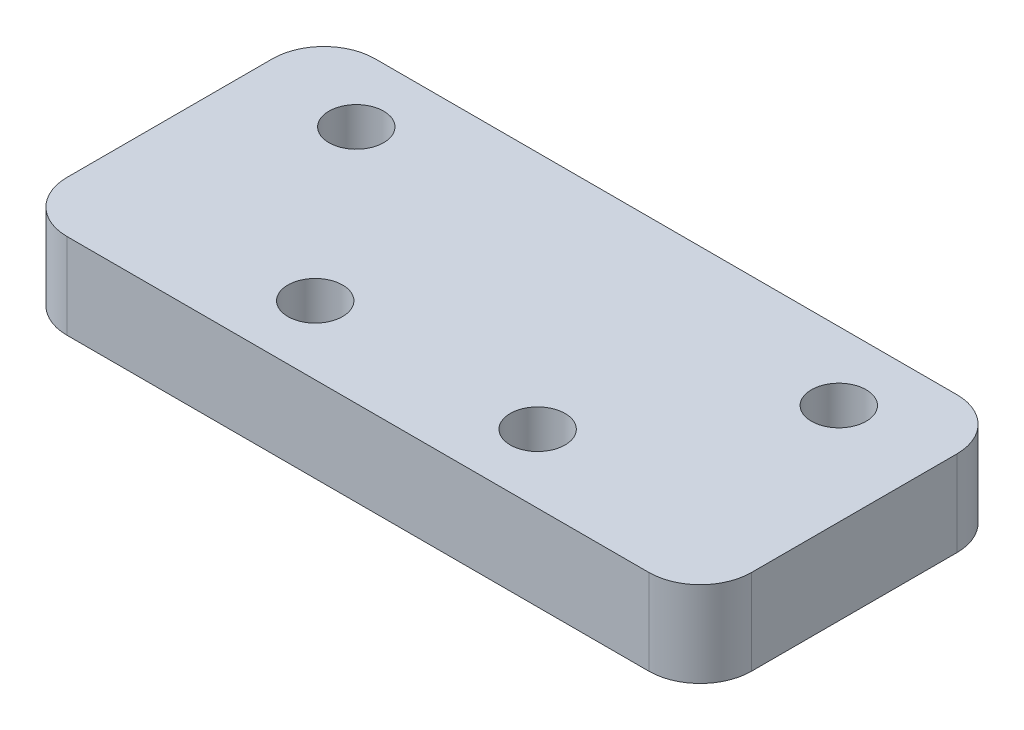
ISO-10303-21;
HEADER;
FILE_DESCRIPTION(('STEP AP214'),'2;1');
FILE_NAME('part.step','',(''),(''),'','','');
FILE_SCHEMA(('AUTOMOTIVE_DESIGN { 1 0 10303 214 1 1 1 1 }'));
ENDSEC;
DATA;
#1=APPLICATION_CONTEXT('core data for automotive mechanical design processes');
#2=APPLICATION_PROTOCOL_DEFINITION('international standard','automotive_design',2000,#1);
#3=PRODUCT_CONTEXT('',#1,'mechanical');
#4=PRODUCT('Part','Part','',(#3));
#5=PRODUCT_RELATED_PRODUCT_CATEGORY('part','',(#4));
#6=PRODUCT_DEFINITION_FORMATION('','',#4);
#7=PRODUCT_DEFINITION_CONTEXT('part definition',#1,'design');
#8=PRODUCT_DEFINITION('design','',#6,#7);
#9=PRODUCT_DEFINITION_SHAPE('','',#8);
#10=(LENGTH_UNIT() NAMED_UNIT(*) SI_UNIT(.MILLI.,.METRE.));
#11=(NAMED_UNIT(*) PLANE_ANGLE_UNIT() SI_UNIT($,.RADIAN.));
#12=(NAMED_UNIT(*) SI_UNIT($,.STERADIAN.) SOLID_ANGLE_UNIT());
#13=UNCERTAINTY_MEASURE_WITH_UNIT(LENGTH_MEASURE(1.E-05),#10,'distance_accuracy_value','');
#14=(GEOMETRIC_REPRESENTATION_CONTEXT(3) GLOBAL_UNCERTAINTY_ASSIGNED_CONTEXT((#13)) GLOBAL_UNIT_ASSIGNED_CONTEXT((#10,
#11,#12)) REPRESENTATION_CONTEXT('',''));
#15=CARTESIAN_POINT('',(0.,0.,0.));
#16=DIRECTION('',(0.,0.,1.));
#17=DIRECTION('',(1.,0.,0.));
#18=AXIS2_PLACEMENT_3D('',#15,#16,#17);
#19=CARTESIAN_POINT('',(0.,5.,0.));
#20=DIRECTION('',(0.,-1.,0.));
#21=DIRECTION('',(0.,0.,-1.));
#22=AXIS2_PLACEMENT_3D('',#19,#20,#21);
#23=PLANE('',#22);
#24=DIRECTION('',(0.,0.,-1.));
#25=VECTOR('',#24,1.);
#26=CARTESIAN_POINT('',(40.,5.,0.));
#27=LINE('',#26,#25);
#28=CARTESIAN_POINT('',(40.,5.,-3.));
#29=VERTEX_POINT('',#28);
#30=CARTESIAN_POINT('',(40.,5.,-15.));
#31=VERTEX_POINT('',#30);
#32=EDGE_CURVE('E217',#29,#31,#27,.T.);
#33=ORIENTED_EDGE('',*,*,#32,.T.);
#34=CARTESIAN_POINT('',(37.,5.,-15.));
#35=DIRECTION('',(0.,-1.,0.));
#36=DIRECTION('',(0.,0.,-1.));
#37=AXIS2_PLACEMENT_3D('',#34,#35,#36);
#38=CIRCLE('',#37,3.);
#39=CARTESIAN_POINT('',(37.,5.,-18.));
#40=VERTEX_POINT('',#39);
#41=EDGE_CURVE('E184',#31,#40,#38,.F.);
#42=ORIENTED_EDGE('',*,*,#41,.T.);
#43=DIRECTION('',(-1.,0.,0.));
#44=VECTOR('',#43,1.);
#45=CARTESIAN_POINT('',(0.,5.,-18.));
#46=LINE('',#45,#44);
#47=CARTESIAN_POINT('',(3.,5.,-18.));
#48=VERTEX_POINT('',#47);
#49=EDGE_CURVE('E141',#40,#48,#46,.T.);
#50=ORIENTED_EDGE('',*,*,#49,.T.);
#51=CARTESIAN_POINT('',(3.,5.,-15.));
#52=DIRECTION('',(0.,-1.,0.));
#53=DIRECTION('',(0.,0.,-1.));
#54=AXIS2_PLACEMENT_3D('',#51,#52,#53);
#55=CIRCLE('',#54,3.);
#56=CARTESIAN_POINT('',(0.,5.,-15.));
#57=VERTEX_POINT('',#56);
#58=EDGE_CURVE('E176',#48,#57,#55,.F.);
#59=ORIENTED_EDGE('',*,*,#58,.T.);
#60=DIRECTION('',(0.,0.,1.));
#61=VECTOR('',#60,1.);
#62=CARTESIAN_POINT('',(0.,5.,0.));
#63=LINE('',#62,#61);
#64=CARTESIAN_POINT('',(0.,5.,-3.));
#65=VERTEX_POINT('',#64);
#66=EDGE_CURVE('E150',#57,#65,#63,.T.);
#67=ORIENTED_EDGE('',*,*,#66,.T.);
#68=CARTESIAN_POINT('',(3.,5.,-3.));
#69=DIRECTION('',(0.,-1.,0.));
#70=DIRECTION('',(0.,0.,-1.));
#71=AXIS2_PLACEMENT_3D('',#68,#69,#70);
#72=CIRCLE('',#71,3.);
#73=CARTESIAN_POINT('',(3.,5.,0.));
#74=VERTEX_POINT('',#73);
#75=EDGE_CURVE('E76',#65,#74,#72,.F.);
#76=ORIENTED_EDGE('',*,*,#75,.T.);
#77=DIRECTION('',(1.,0.,0.));
#78=VECTOR('',#77,1.);
#79=CARTESIAN_POINT('',(0.,5.,0.));
#80=LINE('',#79,#78);
#81=CARTESIAN_POINT('',(37.,5.,0.));
#82=VERTEX_POINT('',#81);
#83=EDGE_CURVE('E156',#74,#82,#80,.T.);
#84=ORIENTED_EDGE('',*,*,#83,.T.);
#85=CARTESIAN_POINT('',(37.,5.,-3.));
#86=DIRECTION('',(0.,-1.,0.));
#87=DIRECTION('',(0.,0.,-1.));
#88=AXIS2_PLACEMENT_3D('',#85,#86,#87);
#89=CIRCLE('',#88,3.);
#90=EDGE_CURVE('E181',#82,#29,#89,.F.);
#91=ORIENTED_EDGE('',*,*,#90,.T.);
#92=EDGE_LOOP('',(#33,#42,#50,#59,#67,#76,#84,#91));
#93=FACE_BOUND('',#92,.T.);
#94=CARTESIAN_POINT('',(5.9,5.,-14.));
#95=DIRECTION('',(0.,1.,0.));
#96=DIRECTION('',(0.,0.,1.));
#97=AXIS2_PLACEMENT_3D('',#94,#95,#96);
#98=CIRCLE('',#97,1.6);
#99=CARTESIAN_POINT('',(5.9,5.,-12.4));
#100=VERTEX_POINT('',#99);
#101=EDGE_CURVE('E206',#100,#100,#98,.T.);
#102=ORIENTED_EDGE('',*,*,#101,.F.);
#103=EDGE_LOOP('',(#102));
#104=FACE_BOUND('',#103,.T.);
#105=CARTESIAN_POINT('',(34.1,5.,-14.));
#106=DIRECTION('',(0.,1.,0.));
#107=DIRECTION('',(0.,0.,1.));
#108=AXIS2_PLACEMENT_3D('',#105,#106,#107);
#109=CIRCLE('',#108,1.6);
#110=CARTESIAN_POINT('',(34.1,5.,-12.4));
#111=VERTEX_POINT('',#110);
#112=EDGE_CURVE('E225',#111,#111,#109,.T.);
#113=ORIENTED_EDGE('',*,*,#112,.F.);
#114=EDGE_LOOP('',(#113));
#115=FACE_BOUND('',#114,.T.);
#116=CARTESIAN_POINT('',(13.5,5.,-4.));
#117=DIRECTION('',(0.,1.,0.));
#118=DIRECTION('',(0.,0.,1.));
#119=AXIS2_PLACEMENT_3D('',#116,#117,#118);
#120=CIRCLE('',#119,1.6);
#121=CARTESIAN_POINT('',(13.5,5.,-2.4));
#122=VERTEX_POINT('',#121);
#123=EDGE_CURVE('E231',#122,#122,#120,.T.);
#124=ORIENTED_EDGE('',*,*,#123,.F.);
#125=EDGE_LOOP('',(#124));
#126=FACE_BOUND('',#125,.T.);
#127=CARTESIAN_POINT('',(26.5,5.,-4.));
#128=DIRECTION('',(0.,1.,0.));
#129=DIRECTION('',(0.,0.,1.));
#130=AXIS2_PLACEMENT_3D('',#127,#128,#129);
#131=CIRCLE('',#130,1.6);
#132=CARTESIAN_POINT('',(26.5,5.,-2.4));
#133=VERTEX_POINT('',#132);
#134=EDGE_CURVE('E239',#133,#133,#131,.T.);
#135=ORIENTED_EDGE('',*,*,#134,.F.);
#136=EDGE_LOOP('',(#135));
#137=FACE_BOUND('',#136,.T.);
#138=ADVANCED_FACE('F53',(#93,#104,#115,#126,#137),#23,.F.);
#139=CARTESIAN_POINT('',(0.,0.,0.));
#140=DIRECTION('',(0.,-1.,0.));
#141=DIRECTION('',(0.,0.,-1.));
#142=AXIS2_PLACEMENT_3D('',#139,#140,#141);
#143=PLANE('',#142);
#144=CARTESIAN_POINT('',(13.5,0.,-4.));
#145=DIRECTION('',(0.,1.,0.));
#146=DIRECTION('',(0.,0.,1.));
#147=AXIS2_PLACEMENT_3D('',#144,#145,#146);
#148=CIRCLE('',#147,1.6);
#149=CARTESIAN_POINT('',(13.5,0.,-2.4));
#150=VERTEX_POINT('',#149);
#151=EDGE_CURVE('E235',#150,#150,#148,.T.);
#152=ORIENTED_EDGE('',*,*,#151,.T.);
#153=EDGE_LOOP('',(#152));
#154=FACE_BOUND('',#153,.T.);
#155=CARTESIAN_POINT('',(5.9,0.,-14.));
#156=DIRECTION('',(0.,1.,0.));
#157=DIRECTION('',(0.,0.,1.));
#158=AXIS2_PLACEMENT_3D('',#155,#156,#157);
#159=CIRCLE('',#158,1.6);
#160=CARTESIAN_POINT('',(5.9,0.,-12.4));
#161=VERTEX_POINT('',#160);
#162=EDGE_CURVE('E212',#161,#161,#159,.T.);
#163=ORIENTED_EDGE('',*,*,#162,.T.);
#164=EDGE_LOOP('',(#163));
#165=FACE_BOUND('',#164,.T.);
#166=DIRECTION('',(-1.,0.,0.));
#167=VECTOR('',#166,1.);
#168=CARTESIAN_POINT('',(0.,0.,-18.));
#169=LINE('',#168,#167);
#170=CARTESIAN_POINT('',(37.,0.,-18.));
#171=VERTEX_POINT('',#170);
#172=CARTESIAN_POINT('',(3.,0.,-18.));
#173=VERTEX_POINT('',#172);
#174=EDGE_CURVE('E138',#171,#173,#169,.T.);
#175=ORIENTED_EDGE('',*,*,#174,.F.);
#176=CARTESIAN_POINT('',(37.,0.,-15.));
#177=DIRECTION('',(0.,-1.,0.));
#178=DIRECTION('',(0.,0.,-1.));
#179=AXIS2_PLACEMENT_3D('',#176,#177,#178);
#180=CIRCLE('',#179,3.);
#181=CARTESIAN_POINT('',(40.,0.,-15.));
#182=VERTEX_POINT('',#181);
#183=EDGE_CURVE('E120',#171,#182,#180,.T.);
#184=ORIENTED_EDGE('',*,*,#183,.T.);
#185=DIRECTION('',(0.,0.,-1.));
#186=VECTOR('',#185,1.);
#187=CARTESIAN_POINT('',(40.,0.,0.));
#188=LINE('',#187,#186);
#189=CARTESIAN_POINT('',(40.,0.,-3.));
#190=VERTEX_POINT('',#189);
#191=EDGE_CURVE('E151',#190,#182,#188,.T.);
#192=ORIENTED_EDGE('',*,*,#191,.F.);
#193=CARTESIAN_POINT('',(37.,0.,-3.));
#194=DIRECTION('',(0.,-1.,0.));
#195=DIRECTION('',(0.,0.,-1.));
#196=AXIS2_PLACEMENT_3D('',#193,#194,#195);
#197=CIRCLE('',#196,3.);
#198=CARTESIAN_POINT('',(37.,0.,0.));
#199=VERTEX_POINT('',#198);
#200=EDGE_CURVE('E132',#190,#199,#197,.T.);
#201=ORIENTED_EDGE('',*,*,#200,.T.);
#202=DIRECTION('',(1.,0.,0.));
#203=VECTOR('',#202,1.);
#204=CARTESIAN_POINT('',(0.,0.,0.));
#205=LINE('',#204,#203);
#206=CARTESIAN_POINT('',(3.,0.,0.));
#207=VERTEX_POINT('',#206);
#208=EDGE_CURVE('E158',#207,#199,#205,.T.);
#209=ORIENTED_EDGE('',*,*,#208,.F.);
#210=CARTESIAN_POINT('',(3.,0.,-3.));
#211=DIRECTION('',(0.,-1.,0.));
#212=DIRECTION('',(0.,0.,-1.));
#213=AXIS2_PLACEMENT_3D('',#210,#211,#212);
#214=CIRCLE('',#213,3.);
#215=CARTESIAN_POINT('',(0.,0.,-3.));
#216=VERTEX_POINT('',#215);
#217=EDGE_CURVE('E166',#207,#216,#214,.T.);
#218=ORIENTED_EDGE('',*,*,#217,.T.);
#219=DIRECTION('',(0.,0.,1.));
#220=VECTOR('',#219,1.);
#221=CARTESIAN_POINT('',(0.,0.,0.));
#222=LINE('',#221,#220);
#223=CARTESIAN_POINT('',(0.,0.,-15.));
#224=VERTEX_POINT('',#223);
#225=EDGE_CURVE('E200',#224,#216,#222,.T.);
#226=ORIENTED_EDGE('',*,*,#225,.F.);
#227=CARTESIAN_POINT('',(3.,0.,-15.));
#228=DIRECTION('',(0.,-1.,0.));
#229=DIRECTION('',(0.,0.,-1.));
#230=AXIS2_PLACEMENT_3D('',#227,#228,#229);
#231=CIRCLE('',#230,3.);
#232=EDGE_CURVE('E143',#224,#173,#231,.T.);
#233=ORIENTED_EDGE('',*,*,#232,.T.);
#234=EDGE_LOOP('',(#175,#184,#192,#201,#209,#218,#226,#233));
#235=FACE_BOUND('',#234,.T.);
#236=CARTESIAN_POINT('',(34.1,0.,-14.));
#237=DIRECTION('',(0.,1.,0.));
#238=DIRECTION('',(0.,0.,1.));
#239=AXIS2_PLACEMENT_3D('',#236,#237,#238);
#240=CIRCLE('',#239,1.6);
#241=CARTESIAN_POINT('',(34.1,0.,-12.4));
#242=VERTEX_POINT('',#241);
#243=EDGE_CURVE('E227',#242,#242,#240,.T.);
#244=ORIENTED_EDGE('',*,*,#243,.T.);
#245=EDGE_LOOP('',(#244));
#246=FACE_BOUND('',#245,.T.);
#247=CARTESIAN_POINT('',(26.5,0.,-4.));
#248=DIRECTION('',(0.,1.,0.));
#249=DIRECTION('',(0.,0.,1.));
#250=AXIS2_PLACEMENT_3D('',#247,#248,#249);
#251=CIRCLE('',#250,1.6);
#252=CARTESIAN_POINT('',(26.5,0.,-2.4));
#253=VERTEX_POINT('',#252);
#254=EDGE_CURVE('E243',#253,#253,#251,.T.);
#255=ORIENTED_EDGE('',*,*,#254,.T.);
#256=EDGE_LOOP('',(#255));
#257=FACE_BOUND('',#256,.T.);
#258=ADVANCED_FACE('F146',(#154,#165,#235,#246,#257),#143,.T.);
#259=CARTESIAN_POINT('',(0.,5.,0.));
#260=DIRECTION('',(1.,0.,0.));
#261=DIRECTION('',(0.,0.,-1.));
#262=AXIS2_PLACEMENT_3D('',#259,#260,#261);
#263=PLANE('',#262);
#264=ORIENTED_EDGE('',*,*,#225,.T.);
#265=DIRECTION('',(0.,-1.,0.));
#266=VECTOR('',#265,1.);
#267=CARTESIAN_POINT('',(0.,5.,-3.));
#268=LINE('',#267,#266);
#269=EDGE_CURVE('E13',#216,#65,#268,.F.);
#270=ORIENTED_EDGE('',*,*,#269,.T.);
#271=ORIENTED_EDGE('',*,*,#66,.F.);
#272=DIRECTION('',(0.,-1.,0.));
#273=VECTOR('',#272,1.);
#274=CARTESIAN_POINT('',(0.,5.,-15.));
#275=LINE('',#274,#273);
#276=EDGE_CURVE('E62',#57,#224,#275,.T.);
#277=ORIENTED_EDGE('',*,*,#276,.T.);
#278=EDGE_LOOP('',(#264,#270,#271,#277));
#279=FACE_BOUND('',#278,.T.);
#280=ADVANCED_FACE('F199',(#279),#263,.F.);
#281=CARTESIAN_POINT('',(0.,5.,0.));
#282=DIRECTION('',(0.,0.,-1.));
#283=DIRECTION('',(-1.,0.,0.));
#284=AXIS2_PLACEMENT_3D('',#281,#282,#283);
#285=PLANE('',#284);
#286=ORIENTED_EDGE('',*,*,#208,.T.);
#287=DIRECTION('',(0.,-1.,0.));
#288=VECTOR('',#287,1.);
#289=CARTESIAN_POINT('',(37.,5.,0.));
#290=LINE('',#289,#288);
#291=EDGE_CURVE('E69',#199,#82,#290,.F.);
#292=ORIENTED_EDGE('',*,*,#291,.T.);
#293=ORIENTED_EDGE('',*,*,#83,.F.);
#294=DIRECTION('',(0.,-1.,0.));
#295=VECTOR('',#294,1.);
#296=CARTESIAN_POINT('',(3.,5.,0.));
#297=LINE('',#296,#295);
#298=EDGE_CURVE('E187',#74,#207,#297,.T.);
#299=ORIENTED_EDGE('',*,*,#298,.T.);
#300=EDGE_LOOP('',(#286,#292,#293,#299));
#301=FACE_BOUND('',#300,.T.);
#302=ADVANCED_FACE('F273',(#301),#285,.F.);
#303=CARTESIAN_POINT('',(40.,5.,0.));
#304=DIRECTION('',(-1.,0.,0.));
#305=DIRECTION('',(0.,0.,1.));
#306=AXIS2_PLACEMENT_3D('',#303,#304,#305);
#307=PLANE('',#306);
#308=ORIENTED_EDGE('',*,*,#191,.T.);
#309=DIRECTION('',(0.,-1.,0.));
#310=VECTOR('',#309,1.);
#311=CARTESIAN_POINT('',(40.,5.,-15.));
#312=LINE('',#311,#310);
#313=EDGE_CURVE('E125',#182,#31,#312,.F.);
#314=ORIENTED_EDGE('',*,*,#313,.T.);
#315=ORIENTED_EDGE('',*,*,#32,.F.);
#316=DIRECTION('',(0.,-1.,0.));
#317=VECTOR('',#316,1.);
#318=CARTESIAN_POINT('',(40.,5.,-3.));
#319=LINE('',#318,#317);
#320=EDGE_CURVE('E131',#29,#190,#319,.T.);
#321=ORIENTED_EDGE('',*,*,#320,.T.);
#322=EDGE_LOOP('',(#308,#314,#315,#321));
#323=FACE_BOUND('',#322,.T.);
#324=ADVANCED_FACE('F270',(#323),#307,.F.);
#325=CARTESIAN_POINT('',(0.,5.,-18.));
#326=DIRECTION('',(0.,0.,1.));
#327=DIRECTION('',(1.,0.,0.));
#328=AXIS2_PLACEMENT_3D('',#325,#326,#327);
#329=PLANE('',#328);
#330=ORIENTED_EDGE('',*,*,#49,.F.);
#331=DIRECTION('',(0.,-1.,0.));
#332=VECTOR('',#331,1.);
#333=CARTESIAN_POINT('',(37.,5.,-18.));
#334=LINE('',#333,#332);
#335=EDGE_CURVE('E124',#40,#171,#334,.T.);
#336=ORIENTED_EDGE('',*,*,#335,.T.);
#337=ORIENTED_EDGE('',*,*,#174,.T.);
#338=DIRECTION('',(0.,-1.,0.));
#339=VECTOR('',#338,1.);
#340=CARTESIAN_POINT('',(3.,5.,-18.));
#341=LINE('',#340,#339);
#342=EDGE_CURVE('E144',#173,#48,#341,.F.);
#343=ORIENTED_EDGE('',*,*,#342,.T.);
#344=EDGE_LOOP('',(#330,#336,#337,#343));
#345=FACE_BOUND('',#344,.T.);
#346=ADVANCED_FACE('F137',(#345),#329,.F.);
#347=CARTESIAN_POINT('',(5.9,5.,-14.));
#348=DIRECTION('',(0.,-1.,0.));
#349=DIRECTION('',(0.,0.,-1.));
#350=AXIS2_PLACEMENT_3D('',#347,#348,#349);
#351=CYLINDRICAL_SURFACE('',#350,1.6);
#352=ORIENTED_EDGE('',*,*,#101,.T.);
#353=EDGE_LOOP('',(#352));
#354=FACE_BOUND('',#353,.T.);
#355=ORIENTED_EDGE('',*,*,#162,.F.);
#356=EDGE_LOOP('',(#355));
#357=FACE_BOUND('',#356,.T.);
#358=ADVANCED_FACE('F265',(#354,#357),#351,.F.);
#359=CARTESIAN_POINT('',(34.1,5.,-14.));
#360=DIRECTION('',(0.,-1.,0.));
#361=DIRECTION('',(0.,0.,-1.));
#362=AXIS2_PLACEMENT_3D('',#359,#360,#361);
#363=CYLINDRICAL_SURFACE('',#362,1.6);
#364=ORIENTED_EDGE('',*,*,#112,.T.);
#365=EDGE_LOOP('',(#364));
#366=FACE_BOUND('',#365,.T.);
#367=ORIENTED_EDGE('',*,*,#243,.F.);
#368=EDGE_LOOP('',(#367));
#369=FACE_BOUND('',#368,.T.);
#370=ADVANCED_FACE('F330',(#366,#369),#363,.F.);
#371=CARTESIAN_POINT('',(13.5,5.,-4.));
#372=DIRECTION('',(0.,-1.,0.));
#373=DIRECTION('',(0.,0.,-1.));
#374=AXIS2_PLACEMENT_3D('',#371,#372,#373);
#375=CYLINDRICAL_SURFACE('',#374,1.6);
#376=ORIENTED_EDGE('',*,*,#123,.T.);
#377=EDGE_LOOP('',(#376));
#378=FACE_BOUND('',#377,.T.);
#379=ORIENTED_EDGE('',*,*,#151,.F.);
#380=EDGE_LOOP('',(#379));
#381=FACE_BOUND('',#380,.T.);
#382=ADVANCED_FACE('F321',(#378,#381),#375,.F.);
#383=CARTESIAN_POINT('',(26.5,5.,-4.));
#384=DIRECTION('',(0.,-1.,0.));
#385=DIRECTION('',(0.,0.,-1.));
#386=AXIS2_PLACEMENT_3D('',#383,#384,#385);
#387=CYLINDRICAL_SURFACE('',#386,1.6);
#388=ORIENTED_EDGE('',*,*,#134,.T.);
#389=EDGE_LOOP('',(#388));
#390=FACE_BOUND('',#389,.T.);
#391=ORIENTED_EDGE('',*,*,#254,.F.);
#392=EDGE_LOOP('',(#391));
#393=FACE_BOUND('',#392,.T.);
#394=ADVANCED_FACE('F252',(#390,#393),#387,.F.);
#395=CARTESIAN_POINT('',(37.,5.,-15.));
#396=DIRECTION('',(0.,-1.,0.));
#397=DIRECTION('',(0.,0.,-1.));
#398=AXIS2_PLACEMENT_3D('',#395,#396,#397);
#399=CYLINDRICAL_SURFACE('',#398,3.);
#400=ORIENTED_EDGE('',*,*,#41,.F.);
#401=ORIENTED_EDGE('',*,*,#313,.F.);
#402=ORIENTED_EDGE('',*,*,#183,.F.);
#403=ORIENTED_EDGE('',*,*,#335,.F.);
#404=EDGE_LOOP('',(#400,#401,#402,#403));
#405=FACE_BOUND('',#404,.T.);
#406=ADVANCED_FACE('F123',(#405),#399,.T.);
#407=CARTESIAN_POINT('',(37.,5.,-3.));
#408=DIRECTION('',(0.,-1.,0.));
#409=DIRECTION('',(0.,0.,-1.));
#410=AXIS2_PLACEMENT_3D('',#407,#408,#409);
#411=CYLINDRICAL_SURFACE('',#410,3.);
#412=ORIENTED_EDGE('',*,*,#90,.F.);
#413=ORIENTED_EDGE('',*,*,#291,.F.);
#414=ORIENTED_EDGE('',*,*,#200,.F.);
#415=ORIENTED_EDGE('',*,*,#320,.F.);
#416=EDGE_LOOP('',(#412,#413,#414,#415));
#417=FACE_BOUND('',#416,.T.);
#418=ADVANCED_FACE('F281',(#417),#411,.T.);
#419=CARTESIAN_POINT('',(3.,5.,-3.));
#420=DIRECTION('',(0.,-1.,0.));
#421=DIRECTION('',(0.,0.,-1.));
#422=AXIS2_PLACEMENT_3D('',#419,#420,#421);
#423=CYLINDRICAL_SURFACE('',#422,3.);
#424=ORIENTED_EDGE('',*,*,#75,.F.);
#425=ORIENTED_EDGE('',*,*,#269,.F.);
#426=ORIENTED_EDGE('',*,*,#217,.F.);
#427=ORIENTED_EDGE('',*,*,#298,.F.);
#428=EDGE_LOOP('',(#424,#425,#426,#427));
#429=FACE_BOUND('',#428,.T.);
#430=ADVANCED_FACE('F283',(#429),#423,.T.);
#431=CARTESIAN_POINT('',(3.,5.,-15.));
#432=DIRECTION('',(0.,-1.,0.));
#433=DIRECTION('',(0.,0.,-1.));
#434=AXIS2_PLACEMENT_3D('',#431,#432,#433);
#435=CYLINDRICAL_SURFACE('',#434,3.);
#436=ORIENTED_EDGE('',*,*,#58,.F.);
#437=ORIENTED_EDGE('',*,*,#342,.F.);
#438=ORIENTED_EDGE('',*,*,#232,.F.);
#439=ORIENTED_EDGE('',*,*,#276,.F.);
#440=EDGE_LOOP('',(#436,#437,#438,#439));
#441=FACE_BOUND('',#440,.T.);
#442=ADVANCED_FACE('F55',(#441),#435,.T.);
#443=CLOSED_SHELL('',(#138,#258,#280,#302,#324,#346,#358,#370,#382,#394,#406,#418,#430,#442));
#444=MANIFOLD_SOLID_BREP('B2',#443);
#445=ADVANCED_BREP_SHAPE_REPRESENTATION('',(#18,#444),#14);
#446=SHAPE_DEFINITION_REPRESENTATION(#9,#445);
ENDSEC;
END-ISO-10303-21;
